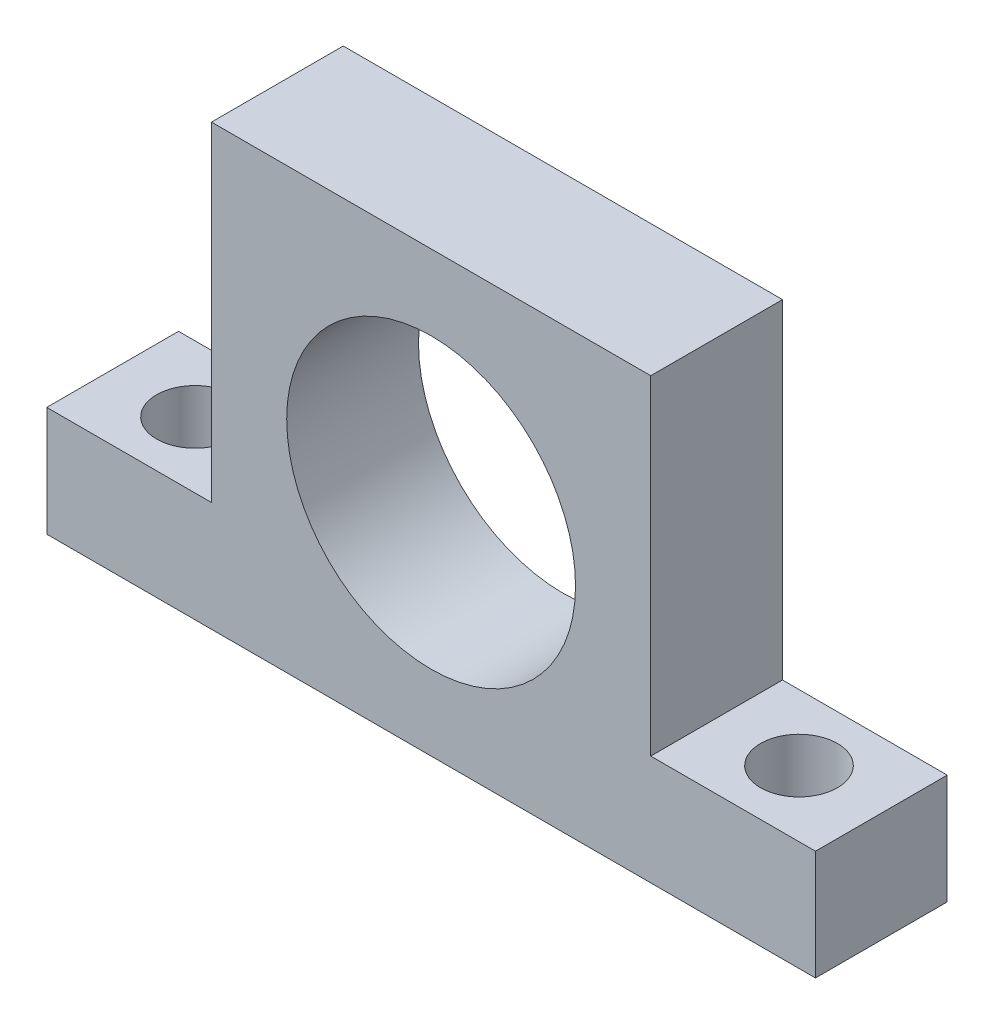
ISO-10303-21;
HEADER;
FILE_DESCRIPTION(('STEP AP214'),'2;1');
FILE_NAME('part.step','',(''),(''),'','','');
FILE_SCHEMA(('AUTOMOTIVE_DESIGN { 1 0 10303 214 1 1 1 1 }'));
ENDSEC;
DATA;
#1=APPLICATION_CONTEXT('core data for automotive mechanical design processes');
#2=APPLICATION_PROTOCOL_DEFINITION('international standard','automotive_design',2000,#1);
#3=PRODUCT_CONTEXT('',#1,'mechanical');
#4=PRODUCT('Part','Part','',(#3));
#5=PRODUCT_RELATED_PRODUCT_CATEGORY('part','',(#4));
#6=PRODUCT_DEFINITION_FORMATION('','',#4);
#7=PRODUCT_DEFINITION_CONTEXT('part definition',#1,'design');
#8=PRODUCT_DEFINITION('design','',#6,#7);
#9=PRODUCT_DEFINITION_SHAPE('','',#8);
#10=(LENGTH_UNIT() NAMED_UNIT(*) SI_UNIT(.MILLI.,.METRE.));
#11=(NAMED_UNIT(*) PLANE_ANGLE_UNIT() SI_UNIT($,.RADIAN.));
#12=(NAMED_UNIT(*) SI_UNIT($,.STERADIAN.) SOLID_ANGLE_UNIT());
#13=UNCERTAINTY_MEASURE_WITH_UNIT(LENGTH_MEASURE(1.E-05),#10,'distance_accuracy_value','');
#14=(GEOMETRIC_REPRESENTATION_CONTEXT(3) GLOBAL_UNCERTAINTY_ASSIGNED_CONTEXT((#13)) GLOBAL_UNIT_ASSIGNED_CONTEXT((#10,
#11,#12)) REPRESENTATION_CONTEXT('',''));
#15=CARTESIAN_POINT('',(0.,0.,0.));
#16=DIRECTION('',(0.,0.,1.));
#17=DIRECTION('',(1.,0.,0.));
#18=AXIS2_PLACEMENT_3D('',#15,#16,#17);
#19=CARTESIAN_POINT('',(0.,0.,12.));
#20=DIRECTION('',(0.,0.,1.));
#21=DIRECTION('',(1.,0.,0.));
#22=AXIS2_PLACEMENT_3D('',#19,#20,#21);
#23=PLANE('',#22);
#24=DIRECTION('',(1.,0.,0.));
#25=VECTOR('',#24,1.);
#26=CARTESIAN_POINT('',(-15.,0.,12.));
#27=LINE('',#26,#25);
#28=CARTESIAN_POINT('',(-15.,0.,12.));
#29=VERTEX_POINT('',#28);
#30=CARTESIAN_POINT('',(0.,0.,12.));
#31=VERTEX_POINT('',#30);
#32=EDGE_CURVE('E179',#29,#31,#27,.T.);
#33=ORIENTED_EDGE('',*,*,#32,.F.);
#34=DIRECTION('',(0.,-1.,0.));
#35=VECTOR('',#34,1.);
#36=CARTESIAN_POINT('',(-15.,0.,12.));
#37=LINE('',#36,#35);
#38=CARTESIAN_POINT('',(-15.,-10.,12.));
#39=VERTEX_POINT('',#38);
#40=EDGE_CURVE('E139',#29,#39,#37,.T.);
#41=ORIENTED_EDGE('',*,*,#40,.T.);
#42=DIRECTION('',(1.,0.,0.));
#43=VECTOR('',#42,1.);
#44=CARTESIAN_POINT('',(-15.,-10.,12.));
#45=LINE('',#44,#43);
#46=CARTESIAN_POINT('',(55.,-10.,12.));
#47=VERTEX_POINT('',#46);
#48=EDGE_CURVE('E131',#39,#47,#45,.T.);
#49=ORIENTED_EDGE('',*,*,#48,.T.);
#50=DIRECTION('',(0.,-1.,0.));
#51=VECTOR('',#50,1.);
#52=CARTESIAN_POINT('',(55.,0.,12.));
#53=LINE('',#52,#51);
#54=CARTESIAN_POINT('',(55.,0.,12.));
#55=VERTEX_POINT('',#54);
#56=EDGE_CURVE('E137',#55,#47,#53,.T.);
#57=ORIENTED_EDGE('',*,*,#56,.F.);
#58=DIRECTION('',(1.,0.,0.));
#59=VECTOR('',#58,1.);
#60=CARTESIAN_POINT('',(40.,0.,12.));
#61=LINE('',#60,#59);
#62=CARTESIAN_POINT('',(40.,0.,12.));
#63=VERTEX_POINT('',#62);
#64=EDGE_CURVE('E153',#63,#55,#61,.T.);
#65=ORIENTED_EDGE('',*,*,#64,.F.);
#66=DIRECTION('',(0.,1.,0.));
#67=VECTOR('',#66,1.);
#68=CARTESIAN_POINT('',(40.,0.,12.));
#69=LINE('',#68,#67);
#70=CARTESIAN_POINT('',(40.,30.,12.));
#71=VERTEX_POINT('',#70);
#72=EDGE_CURVE('E155',#63,#71,#69,.T.);
#73=ORIENTED_EDGE('',*,*,#72,.T.);
#74=DIRECTION('',(1.,0.,0.));
#75=VECTOR('',#74,1.);
#76=CARTESIAN_POINT('',(0.,30.,12.));
#77=LINE('',#76,#75);
#78=CARTESIAN_POINT('',(0.,30.,12.));
#79=VERTEX_POINT('',#78);
#80=EDGE_CURVE('E200',#79,#71,#77,.T.);
#81=ORIENTED_EDGE('',*,*,#80,.F.);
#82=DIRECTION('',(0.,1.,0.));
#83=VECTOR('',#82,1.);
#84=CARTESIAN_POINT('',(0.,0.,12.));
#85=LINE('',#84,#83);
#86=EDGE_CURVE('E205',#31,#79,#85,.T.);
#87=ORIENTED_EDGE('',*,*,#86,.F.);
#88=EDGE_LOOP('',(#33,#41,#49,#57,#65,#73,#81,#87));
#89=FACE_BOUND('',#88,.T.);
#90=CARTESIAN_POINT('',(20.,10.,12.));
#91=DIRECTION('',(0.,0.,1.));
#92=DIRECTION('',(1.,0.,0.));
#93=AXIS2_PLACEMENT_3D('',#90,#91,#92);
#94=CIRCLE('',#93,13.15);
#95=CARTESIAN_POINT('',(33.15,10.,12.));
#96=VERTEX_POINT('',#95);
#97=EDGE_CURVE('E164',#96,#96,#94,.T.);
#98=ORIENTED_EDGE('',*,*,#97,.F.);
#99=EDGE_LOOP('',(#98));
#100=FACE_BOUND('',#99,.T.);
#101=ADVANCED_FACE('F60',(#89,#100),#23,.T.);
#102=CARTESIAN_POINT('',(0.,0.,0.));
#103=DIRECTION('',(0.,0.,1.));
#104=DIRECTION('',(1.,0.,0.));
#105=AXIS2_PLACEMENT_3D('',#102,#103,#104);
#106=PLANE('',#105);
#107=DIRECTION('',(1.,0.,0.));
#108=VECTOR('',#107,1.);
#109=CARTESIAN_POINT('',(-15.,0.,0.));
#110=LINE('',#109,#108);
#111=CARTESIAN_POINT('',(-15.,0.,0.));
#112=VERTEX_POINT('',#111);
#113=CARTESIAN_POINT('',(0.,0.,0.));
#114=VERTEX_POINT('',#113);
#115=EDGE_CURVE('E160',#112,#114,#110,.T.);
#116=ORIENTED_EDGE('',*,*,#115,.T.);
#117=DIRECTION('',(0.,1.,0.));
#118=VECTOR('',#117,1.);
#119=CARTESIAN_POINT('',(0.,0.,0.));
#120=LINE('',#119,#118);
#121=CARTESIAN_POINT('',(0.,30.,0.));
#122=VERTEX_POINT('',#121);
#123=EDGE_CURVE('E163',#114,#122,#120,.T.);
#124=ORIENTED_EDGE('',*,*,#123,.T.);
#125=DIRECTION('',(1.,0.,0.));
#126=VECTOR('',#125,1.);
#127=CARTESIAN_POINT('',(0.,30.,0.));
#128=LINE('',#127,#126);
#129=CARTESIAN_POINT('',(40.,30.,0.));
#130=VERTEX_POINT('',#129);
#131=EDGE_CURVE('E167',#122,#130,#128,.T.);
#132=ORIENTED_EDGE('',*,*,#131,.T.);
#133=DIRECTION('',(0.,1.,0.));
#134=VECTOR('',#133,1.);
#135=CARTESIAN_POINT('',(40.,0.,0.));
#136=LINE('',#135,#134);
#137=CARTESIAN_POINT('',(40.,0.,0.));
#138=VERTEX_POINT('',#137);
#139=EDGE_CURVE('E170',#138,#130,#136,.T.);
#140=ORIENTED_EDGE('',*,*,#139,.F.);
#141=DIRECTION('',(1.,0.,0.));
#142=VECTOR('',#141,1.);
#143=CARTESIAN_POINT('',(40.,0.,0.));
#144=LINE('',#143,#142);
#145=CARTESIAN_POINT('',(55.,0.,0.));
#146=VERTEX_POINT('',#145);
#147=EDGE_CURVE('E173',#138,#146,#144,.T.);
#148=ORIENTED_EDGE('',*,*,#147,.T.);
#149=DIRECTION('',(0.,-1.,0.));
#150=VECTOR('',#149,1.);
#151=CARTESIAN_POINT('',(55.,0.,0.));
#152=LINE('',#151,#150);
#153=CARTESIAN_POINT('',(55.,-10.,0.));
#154=VERTEX_POINT('',#153);
#155=EDGE_CURVE('E176',#146,#154,#152,.T.);
#156=ORIENTED_EDGE('',*,*,#155,.T.);
#157=DIRECTION('',(1.,0.,0.));
#158=VECTOR('',#157,1.);
#159=CARTESIAN_POINT('',(-15.,-10.,0.));
#160=LINE('',#159,#158);
#161=CARTESIAN_POINT('',(-15.,-10.,0.));
#162=VERTEX_POINT('',#161);
#163=EDGE_CURVE('E146',#162,#154,#160,.T.);
#164=ORIENTED_EDGE('',*,*,#163,.F.);
#165=DIRECTION('',(0.,-1.,0.));
#166=VECTOR('',#165,1.);
#167=CARTESIAN_POINT('',(-15.,0.,0.));
#168=LINE('',#167,#166);
#169=EDGE_CURVE('E106',#112,#162,#168,.T.);
#170=ORIENTED_EDGE('',*,*,#169,.F.);
#171=EDGE_LOOP('',(#116,#124,#132,#140,#148,#156,#164,#170));
#172=FACE_BOUND('',#171,.T.);
#173=CARTESIAN_POINT('',(20.,10.,0.));
#174=DIRECTION('',(0.,0.,1.));
#175=DIRECTION('',(1.,0.,0.));
#176=AXIS2_PLACEMENT_3D('',#173,#174,#175);
#177=CIRCLE('',#176,13.15);
#178=CARTESIAN_POINT('',(33.15,10.,0.));
#179=VERTEX_POINT('',#178);
#180=EDGE_CURVE('E210',#179,#179,#177,.T.);
#181=ORIENTED_EDGE('',*,*,#180,.T.);
#182=EDGE_LOOP('',(#181));
#183=FACE_BOUND('',#182,.T.);
#184=ADVANCED_FACE('F190',(#172,#183),#106,.F.);
#185=CARTESIAN_POINT('',(-15.,0.,12.));
#186=DIRECTION('',(0.,1.,0.));
#187=DIRECTION('',(0.,0.,1.));
#188=AXIS2_PLACEMENT_3D('',#185,#186,#187);
#189=PLANE('',#188);
#190=CARTESIAN_POINT('',(-7.5,0.,6.));
#191=DIRECTION('',(0.,1.,0.));
#192=DIRECTION('',(0.,0.,1.));
#193=AXIS2_PLACEMENT_3D('',#190,#191,#192);
#194=CIRCLE('',#193,3.5);
#195=CARTESIAN_POINT('',(-7.5,0.,9.5));
#196=VERTEX_POINT('',#195);
#197=EDGE_CURVE('E222',#196,#196,#194,.T.);
#198=ORIENTED_EDGE('',*,*,#197,.F.);
#199=EDGE_LOOP('',(#198));
#200=FACE_BOUND('',#199,.T.);
#201=ORIENTED_EDGE('',*,*,#115,.F.);
#202=DIRECTION('',(0.,0.,-1.));
#203=VECTOR('',#202,1.);
#204=CARTESIAN_POINT('',(-15.,0.,12.));
#205=LINE('',#204,#203);
#206=EDGE_CURVE('E12',#29,#112,#205,.T.);
#207=ORIENTED_EDGE('',*,*,#206,.F.);
#208=ORIENTED_EDGE('',*,*,#32,.T.);
#209=DIRECTION('',(0.,0.,-1.));
#210=VECTOR('',#209,1.);
#211=CARTESIAN_POINT('',(0.,0.,12.));
#212=LINE('',#211,#210);
#213=EDGE_CURVE('E64',#31,#114,#212,.T.);
#214=ORIENTED_EDGE('',*,*,#213,.T.);
#215=EDGE_LOOP('',(#201,#207,#208,#214));
#216=FACE_BOUND('',#215,.T.);
#217=ADVANCED_FACE('F62',(#200,#216),#189,.T.);
#218=CARTESIAN_POINT('',(-15.,0.,12.));
#219=DIRECTION('',(1.,0.,0.));
#220=DIRECTION('',(0.,1.,0.));
#221=AXIS2_PLACEMENT_3D('',#218,#219,#220);
#222=PLANE('',#221);
#223=ORIENTED_EDGE('',*,*,#169,.T.);
#224=DIRECTION('',(0.,0.,-1.));
#225=VECTOR('',#224,1.);
#226=CARTESIAN_POINT('',(-15.,-10.,12.));
#227=LINE('',#226,#225);
#228=EDGE_CURVE('E70',#39,#162,#227,.T.);
#229=ORIENTED_EDGE('',*,*,#228,.F.);
#230=ORIENTED_EDGE('',*,*,#40,.F.);
#231=ORIENTED_EDGE('',*,*,#206,.T.);
#232=EDGE_LOOP('',(#223,#229,#230,#231));
#233=FACE_BOUND('',#232,.T.);
#234=ADVANCED_FACE('F238',(#233),#222,.F.);
#235=CARTESIAN_POINT('',(-15.,-10.,12.));
#236=DIRECTION('',(0.,1.,0.));
#237=DIRECTION('',(0.,0.,1.));
#238=AXIS2_PLACEMENT_3D('',#235,#236,#237);
#239=PLANE('',#238);
#240=CARTESIAN_POINT('',(-7.5,-10.,6.));
#241=DIRECTION('',(0.,1.,0.));
#242=DIRECTION('',(0.,0.,1.));
#243=AXIS2_PLACEMENT_3D('',#240,#241,#242);
#244=CIRCLE('',#243,3.5);
#245=CARTESIAN_POINT('',(-7.5,-10.,9.5));
#246=VERTEX_POINT('',#245);
#247=EDGE_CURVE('E219',#246,#246,#244,.T.);
#248=ORIENTED_EDGE('',*,*,#247,.T.);
#249=EDGE_LOOP('',(#248));
#250=FACE_BOUND('',#249,.T.);
#251=CARTESIAN_POINT('',(47.5,-10.,6.));
#252=DIRECTION('',(0.,1.,0.));
#253=DIRECTION('',(0.,0.,1.));
#254=AXIS2_PLACEMENT_3D('',#251,#252,#253);
#255=CIRCLE('',#254,3.5);
#256=CARTESIAN_POINT('',(47.5,-10.,9.5));
#257=VERTEX_POINT('',#256);
#258=EDGE_CURVE('E213',#257,#257,#255,.T.);
#259=ORIENTED_EDGE('',*,*,#258,.T.);
#260=EDGE_LOOP('',(#259));
#261=FACE_BOUND('',#260,.T.);
#262=ORIENTED_EDGE('',*,*,#163,.T.);
#263=DIRECTION('',(0.,0.,-1.));
#264=VECTOR('',#263,1.);
#265=CARTESIAN_POINT('',(55.,-10.,12.));
#266=LINE('',#265,#264);
#267=EDGE_CURVE('E143',#47,#154,#266,.T.);
#268=ORIENTED_EDGE('',*,*,#267,.F.);
#269=ORIENTED_EDGE('',*,*,#48,.F.);
#270=ORIENTED_EDGE('',*,*,#228,.T.);
#271=EDGE_LOOP('',(#262,#268,#269,#270));
#272=FACE_BOUND('',#271,.T.);
#273=ADVANCED_FACE('F144',(#250,#261,#272),#239,.F.);
#274=CARTESIAN_POINT('',(55.,0.,12.));
#275=DIRECTION('',(1.,0.,0.));
#276=DIRECTION('',(0.,1.,0.));
#277=AXIS2_PLACEMENT_3D('',#274,#275,#276);
#278=PLANE('',#277);
#279=ORIENTED_EDGE('',*,*,#155,.F.);
#280=DIRECTION('',(0.,0.,-1.));
#281=VECTOR('',#280,1.);
#282=CARTESIAN_POINT('',(55.,0.,12.));
#283=LINE('',#282,#281);
#284=EDGE_CURVE('E150',#55,#146,#283,.T.);
#285=ORIENTED_EDGE('',*,*,#284,.F.);
#286=ORIENTED_EDGE('',*,*,#56,.T.);
#287=ORIENTED_EDGE('',*,*,#267,.T.);
#288=EDGE_LOOP('',(#279,#285,#286,#287));
#289=FACE_BOUND('',#288,.T.);
#290=ADVANCED_FACE('F152',(#289),#278,.T.);
#291=CARTESIAN_POINT('',(40.,0.,12.));
#292=DIRECTION('',(0.,1.,0.));
#293=DIRECTION('',(0.,0.,1.));
#294=AXIS2_PLACEMENT_3D('',#291,#292,#293);
#295=PLANE('',#294);
#296=CARTESIAN_POINT('',(47.5,0.,6.));
#297=DIRECTION('',(0.,1.,0.));
#298=DIRECTION('',(0.,0.,1.));
#299=AXIS2_PLACEMENT_3D('',#296,#297,#298);
#300=CIRCLE('',#299,3.5);
#301=CARTESIAN_POINT('',(47.5,0.,9.5));
#302=VERTEX_POINT('',#301);
#303=EDGE_CURVE('E216',#302,#302,#300,.T.);
#304=ORIENTED_EDGE('',*,*,#303,.F.);
#305=EDGE_LOOP('',(#304));
#306=FACE_BOUND('',#305,.T.);
#307=ORIENTED_EDGE('',*,*,#147,.F.);
#308=DIRECTION('',(0.,0.,-1.));
#309=VECTOR('',#308,1.);
#310=CARTESIAN_POINT('',(40.,0.,12.));
#311=LINE('',#310,#309);
#312=EDGE_CURVE('E183',#63,#138,#311,.T.);
#313=ORIENTED_EDGE('',*,*,#312,.F.);
#314=ORIENTED_EDGE('',*,*,#64,.T.);
#315=ORIENTED_EDGE('',*,*,#284,.T.);
#316=EDGE_LOOP('',(#307,#313,#314,#315));
#317=FACE_BOUND('',#316,.T.);
#318=ADVANCED_FACE('F195',(#306,#317),#295,.T.);
#319=CARTESIAN_POINT('',(40.,0.,12.));
#320=DIRECTION('',(-1.,0.,0.));
#321=DIRECTION('',(0.,-1.,0.));
#322=AXIS2_PLACEMENT_3D('',#319,#320,#321);
#323=PLANE('',#322);
#324=ORIENTED_EDGE('',*,*,#139,.T.);
#325=DIRECTION('',(0.,0.,-1.));
#326=VECTOR('',#325,1.);
#327=CARTESIAN_POINT('',(40.,30.,12.));
#328=LINE('',#327,#326);
#329=EDGE_CURVE('E185',#71,#130,#328,.T.);
#330=ORIENTED_EDGE('',*,*,#329,.F.);
#331=ORIENTED_EDGE('',*,*,#72,.F.);
#332=ORIENTED_EDGE('',*,*,#312,.T.);
#333=EDGE_LOOP('',(#324,#330,#331,#332));
#334=FACE_BOUND('',#333,.T.);
#335=ADVANCED_FACE('F202',(#334),#323,.F.);
#336=CARTESIAN_POINT('',(0.,30.,12.));
#337=DIRECTION('',(0.,1.,0.));
#338=DIRECTION('',(0.,0.,1.));
#339=AXIS2_PLACEMENT_3D('',#336,#337,#338);
#340=PLANE('',#339);
#341=ORIENTED_EDGE('',*,*,#131,.F.);
#342=DIRECTION('',(0.,0.,-1.));
#343=VECTOR('',#342,1.);
#344=CARTESIAN_POINT('',(0.,30.,12.));
#345=LINE('',#344,#343);
#346=EDGE_CURVE('E186',#79,#122,#345,.T.);
#347=ORIENTED_EDGE('',*,*,#346,.F.);
#348=ORIENTED_EDGE('',*,*,#80,.T.);
#349=ORIENTED_EDGE('',*,*,#329,.T.);
#350=EDGE_LOOP('',(#341,#347,#348,#349));
#351=FACE_BOUND('',#350,.T.);
#352=ADVANCED_FACE('F204',(#351),#340,.T.);
#353=CARTESIAN_POINT('',(0.,0.,12.));
#354=DIRECTION('',(-1.,0.,0.));
#355=DIRECTION('',(0.,-1.,0.));
#356=AXIS2_PLACEMENT_3D('',#353,#354,#355);
#357=PLANE('',#356);
#358=ORIENTED_EDGE('',*,*,#123,.F.);
#359=ORIENTED_EDGE('',*,*,#213,.F.);
#360=ORIENTED_EDGE('',*,*,#86,.T.);
#361=ORIENTED_EDGE('',*,*,#346,.T.);
#362=EDGE_LOOP('',(#358,#359,#360,#361));
#363=FACE_BOUND('',#362,.T.);
#364=ADVANCED_FACE('F188',(#363),#357,.T.);
#365=CARTESIAN_POINT('',(20.,10.,12.));
#366=DIRECTION('',(0.,0.,-1.));
#367=DIRECTION('',(-1.,0.,0.));
#368=AXIS2_PLACEMENT_3D('',#365,#366,#367);
#369=CYLINDRICAL_SURFACE('',#368,13.15);
#370=ORIENTED_EDGE('',*,*,#97,.T.);
#371=EDGE_LOOP('',(#370));
#372=FACE_BOUND('',#371,.T.);
#373=ORIENTED_EDGE('',*,*,#180,.F.);
#374=EDGE_LOOP('',(#373));
#375=FACE_BOUND('',#374,.T.);
#376=ADVANCED_FACE('F250',(#372,#375),#369,.F.);
#377=CARTESIAN_POINT('',(47.5,-10.,6.));
#378=DIRECTION('',(0.,1.,0.));
#379=DIRECTION('',(0.,0.,1.));
#380=AXIS2_PLACEMENT_3D('',#377,#378,#379);
#381=CYLINDRICAL_SURFACE('',#380,3.5);
#382=ORIENTED_EDGE('',*,*,#258,.F.);
#383=EDGE_LOOP('',(#382));
#384=FACE_BOUND('',#383,.T.);
#385=ORIENTED_EDGE('',*,*,#303,.T.);
#386=EDGE_LOOP('',(#385));
#387=FACE_BOUND('',#386,.T.);
#388=ADVANCED_FACE('F233',(#384,#387),#381,.F.);
#389=CARTESIAN_POINT('',(-7.5,-10.,6.));
#390=DIRECTION('',(0.,1.,0.));
#391=DIRECTION('',(0.,0.,1.));
#392=AXIS2_PLACEMENT_3D('',#389,#390,#391);
#393=CYLINDRICAL_SURFACE('',#392,3.5);
#394=ORIENTED_EDGE('',*,*,#247,.F.);
#395=EDGE_LOOP('',(#394));
#396=FACE_BOUND('',#395,.T.);
#397=ORIENTED_EDGE('',*,*,#197,.T.);
#398=EDGE_LOOP('',(#397));
#399=FACE_BOUND('',#398,.T.);
#400=ADVANCED_FACE('F230',(#396,#399),#393,.F.);
#401=CLOSED_SHELL('',(#101,#184,#217,#234,#273,#290,#318,#335,#352,#364,#376,#388,#400));
#402=MANIFOLD_SOLID_BREP('B2',#401);
#403=ADVANCED_BREP_SHAPE_REPRESENTATION('',(#18,#402),#14);
#404=SHAPE_DEFINITION_REPRESENTATION(#9,#403);
ENDSEC;
END-ISO-10303-21;
